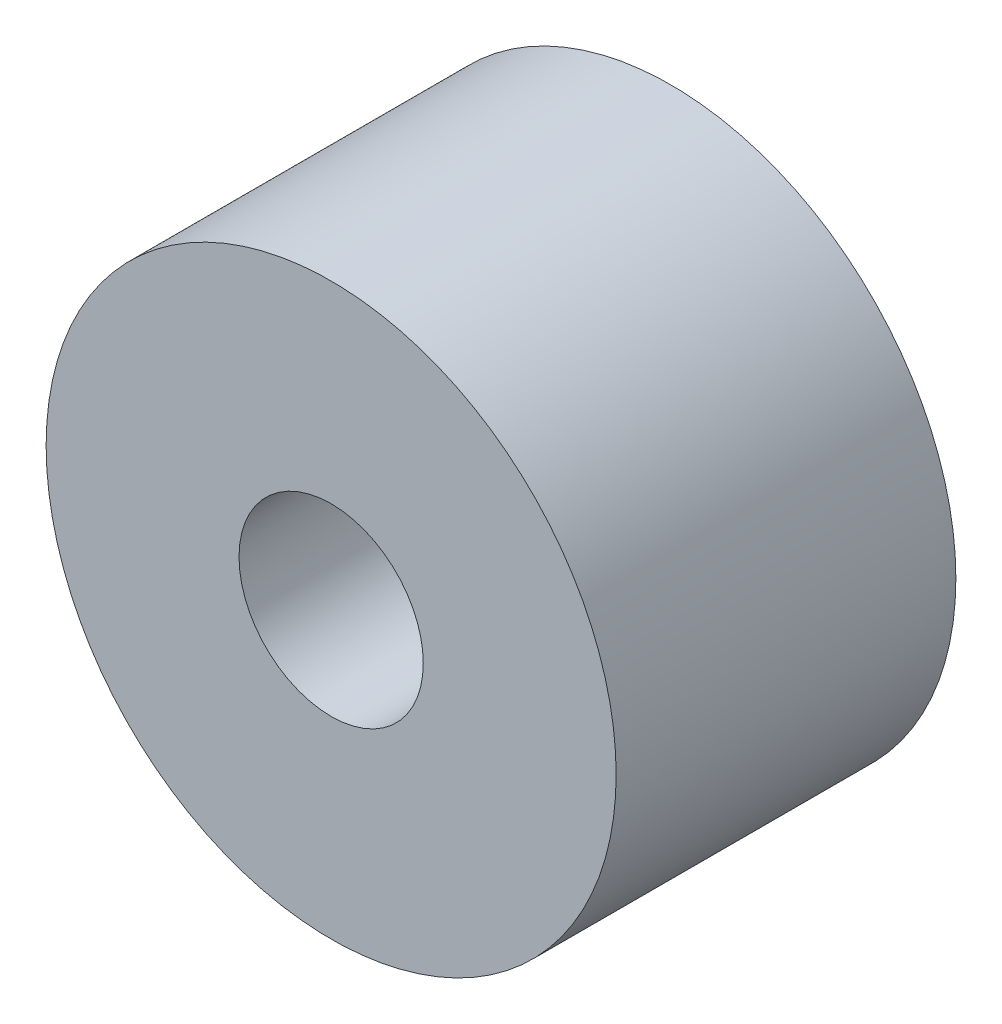
ISO-10303-21;
HEADER;
FILE_DESCRIPTION(('STEP AP214'),'2;1');
FILE_NAME('part.step','',(''),(''),'','','');
FILE_SCHEMA(('AUTOMOTIVE_DESIGN { 1 0 10303 214 1 1 1 1 }'));
ENDSEC;
DATA;
#1=APPLICATION_CONTEXT('core data for automotive mechanical design processes');
#2=APPLICATION_PROTOCOL_DEFINITION('international standard','automotive_design',2000,#1);
#3=PRODUCT_CONTEXT('',#1,'mechanical');
#4=PRODUCT('Part','Part','',(#3));
#5=PRODUCT_RELATED_PRODUCT_CATEGORY('part','',(#4));
#6=PRODUCT_DEFINITION_FORMATION('','',#4);
#7=PRODUCT_DEFINITION_CONTEXT('part definition',#1,'design');
#8=PRODUCT_DEFINITION('design','',#6,#7);
#9=PRODUCT_DEFINITION_SHAPE('','',#8);
#10=(LENGTH_UNIT() NAMED_UNIT(*) SI_UNIT(.MILLI.,.METRE.));
#11=(NAMED_UNIT(*) PLANE_ANGLE_UNIT() SI_UNIT($,.RADIAN.));
#12=(NAMED_UNIT(*) SI_UNIT($,.STERADIAN.) SOLID_ANGLE_UNIT());
#13=UNCERTAINTY_MEASURE_WITH_UNIT(LENGTH_MEASURE(1.E-05),#10,'distance_accuracy_value','');
#14=(GEOMETRIC_REPRESENTATION_CONTEXT(3) GLOBAL_UNCERTAINTY_ASSIGNED_CONTEXT((#13)) GLOBAL_UNIT_ASSIGNED_CONTEXT((#10,
#11,#12)) REPRESENTATION_CONTEXT('',''));
#15=CARTESIAN_POINT('',(0.,0.,0.));
#16=DIRECTION('',(0.,0.,1.));
#17=DIRECTION('',(1.,0.,0.));
#18=AXIS2_PLACEMENT_3D('',#15,#16,#17);
#19=CARTESIAN_POINT('',(0.,0.,10.4254833995939));
#20=DIRECTION('',(0.,0.,-1.));
#21=DIRECTION('',(-1.,0.,0.));
#22=AXIS2_PLACEMENT_3D('',#19,#20,#21);
#23=CYLINDRICAL_SURFACE('',#22,1.6);
#24=CARTESIAN_POINT('',(0.,0.,5.9));
#25=DIRECTION('',(0.,0.,1.));
#26=DIRECTION('',(1.,0.,0.));
#27=AXIS2_PLACEMENT_3D('',#24,#25,#26);
#28=CIRCLE('',#27,1.6);
#29=CARTESIAN_POINT('',(1.6,0.,5.9));
#30=VERTEX_POINT('',#29);
#31=EDGE_CURVE('E145',#30,#30,#28,.F.);
#32=ORIENTED_EDGE('',*,*,#31,.F.);
#33=EDGE_LOOP('',(#32));
#34=FACE_BOUND('',#33,.T.);
#35=CARTESIAN_POINT('',(0.,0.,3.));
#36=DIRECTION('',(0.,0.,-1.));
#37=DIRECTION('',(-1.,0.,0.));
#38=AXIS2_PLACEMENT_3D('',#35,#36,#37);
#39=CIRCLE('',#38,1.6);
#40=CARTESIAN_POINT('',(-1.6,0.,3.));
#41=VERTEX_POINT('',#40);
#42=EDGE_CURVE('E39',#41,#41,#39,.F.);
#43=ORIENTED_EDGE('',*,*,#42,.F.);
#44=EDGE_LOOP('',(#43));
#45=FACE_BOUND('',#44,.T.);
#46=ADVANCED_FACE('F35',(#34,#45),#23,.F.);
#47=CARTESIAN_POINT('',(0.,0.,5.9));
#48=DIRECTION('',(0.,0.,-1.));
#49=DIRECTION('',(-1.,0.,0.));
#50=AXIS2_PLACEMENT_3D('',#47,#48,#49);
#51=CYLINDRICAL_SURFACE('',#50,4.95);
#52=CARTESIAN_POINT('',(0.,0.,5.9));
#53=DIRECTION('',(0.,0.,1.));
#54=DIRECTION('',(1.,0.,0.));
#55=AXIS2_PLACEMENT_3D('',#52,#53,#54);
#56=CIRCLE('',#55,4.95);
#57=CARTESIAN_POINT('',(4.95,0.,5.9));
#58=VERTEX_POINT('',#57);
#59=EDGE_CURVE('E11',#58,#58,#56,.T.);
#60=ORIENTED_EDGE('',*,*,#59,.F.);
#61=EDGE_LOOP('',(#60));
#62=FACE_BOUND('',#61,.T.);
#63=CARTESIAN_POINT('',(0.,0.,0.));
#64=DIRECTION('',(0.,0.,1.));
#65=DIRECTION('',(1.,0.,0.));
#66=AXIS2_PLACEMENT_3D('',#63,#64,#65);
#67=CIRCLE('',#66,4.95);
#68=CARTESIAN_POINT('',(4.95,0.,0.));
#69=VERTEX_POINT('',#68);
#70=EDGE_CURVE('E44',#69,#69,#67,.T.);
#71=ORIENTED_EDGE('',*,*,#70,.T.);
#72=EDGE_LOOP('',(#71));
#73=FACE_BOUND('',#72,.T.);
#74=ADVANCED_FACE('F37',(#62,#73),#51,.T.);
#75=CARTESIAN_POINT('',(0.,0.,5.9));
#76=DIRECTION('',(0.,0.,1.));
#77=DIRECTION('',(1.,0.,0.));
#78=AXIS2_PLACEMENT_3D('',#75,#76,#77);
#79=PLANE('',#78);
#80=ORIENTED_EDGE('',*,*,#31,.T.);
#81=EDGE_LOOP('',(#80));
#82=FACE_BOUND('',#81,.T.);
#83=ORIENTED_EDGE('',*,*,#59,.T.);
#84=EDGE_LOOP('',(#83));
#85=FACE_BOUND('',#84,.T.);
#86=ADVANCED_FACE('F153',(#82,#85),#79,.T.);
#87=CARTESIAN_POINT('',(0.,0.,0.));
#88=DIRECTION('',(0.,0.,1.));
#89=DIRECTION('',(1.,0.,0.));
#90=AXIS2_PLACEMENT_3D('',#87,#88,#89);
#91=PLANE('',#90);
#92=DIRECTION('',(-0.972226533934309,0.234041805483719,0.));
#93=VECTOR('',#92,1.);
#94=CARTESIAN_POINT('',(0.949092992230001,-3.21131683666268,0.));
#95=LINE('',#94,#93);
#96=CARTESIAN_POINT('',(0.949092992230001,-3.21131683666268,0.));
#97=VERTEX_POINT('',#96);
#98=CARTESIAN_POINT('',(-2.30653546403557,-2.42759706015631,0.));
#99=VERTEX_POINT('',#98);
#100=EDGE_CURVE('E127',#97,#99,#95,.T.);
#101=ORIENTED_EDGE('',*,*,#100,.F.);
#102=DIRECTION('',(-0.688799416063631,-0.724951973878546,0.));
#103=VECTOR('',#102,1.);
#104=CARTESIAN_POINT('',(3.25562845626557,-0.783719776506375,0.));
#105=LINE('',#104,#103);
#106=CARTESIAN_POINT('',(3.25562845626557,-0.783719776506375,0.));
#107=VERTEX_POINT('',#106);
#108=EDGE_CURVE('E52',#107,#97,#105,.T.);
#109=ORIENTED_EDGE('',*,*,#108,.F.);
#110=DIRECTION('',(0.283427117870678,-0.958993779362265,0.));
#111=VECTOR('',#110,1.);
#112=CARTESIAN_POINT('',(2.30653546403557,2.42759706015631,0.));
#113=LINE('',#112,#111);
#114=CARTESIAN_POINT('',(2.30653546403557,2.42759706015631,0.));
#115=VERTEX_POINT('',#114);
#116=EDGE_CURVE('E136',#115,#107,#113,.T.);
#117=ORIENTED_EDGE('',*,*,#116,.F.);
#118=DIRECTION('',(0.972226533934309,-0.234041805483719,0.));
#119=VECTOR('',#118,1.);
#120=CARTESIAN_POINT('',(-0.949092992230001,3.21131683666269,0.));
#121=LINE('',#120,#119);
#122=CARTESIAN_POINT('',(-0.949092992230001,3.21131683666269,0.));
#123=VERTEX_POINT('',#122);
#124=EDGE_CURVE('E134',#123,#115,#121,.T.);
#125=ORIENTED_EDGE('',*,*,#124,.F.);
#126=DIRECTION('',(0.688799416063631,0.724951973878546,0.));
#127=VECTOR('',#126,1.);
#128=CARTESIAN_POINT('',(-3.25562845626557,0.783719776506377,0.));
#129=LINE('',#128,#127);
#130=CARTESIAN_POINT('',(-3.25562845626557,0.783719776506377,0.));
#131=VERTEX_POINT('',#130);
#132=EDGE_CURVE('E100',#131,#123,#129,.T.);
#133=ORIENTED_EDGE('',*,*,#132,.F.);
#134=DIRECTION('',(-0.283427117870678,0.958993779362265,0.));
#135=VECTOR('',#134,1.);
#136=CARTESIAN_POINT('',(-2.30653546403557,-2.42759706015631,0.));
#137=LINE('',#136,#135);
#138=EDGE_CURVE('E130',#99,#131,#137,.T.);
#139=ORIENTED_EDGE('',*,*,#138,.F.);
#140=EDGE_LOOP('',(#101,#109,#117,#125,#133,#139));
#141=FACE_BOUND('',#140,.T.);
#142=ORIENTED_EDGE('',*,*,#70,.F.);
#143=EDGE_LOOP('',(#142));
#144=FACE_BOUND('',#143,.T.);
#145=ADVANCED_FACE('F151',(#141,#144),#91,.F.);
#146=CARTESIAN_POINT('',(0.,0.,3.));
#147=DIRECTION('',(0.,0.,-1.));
#148=DIRECTION('',(-1.,0.,0.));
#149=AXIS2_PLACEMENT_3D('',#146,#147,#148);
#150=PLANE('',#149);
#151=DIRECTION('',(-0.688799416063631,-0.724951973878546,0.));
#152=VECTOR('',#151,1.);
#153=CARTESIAN_POINT('',(3.25562845626557,-0.783719776506375,3.));
#154=LINE('',#153,#152);
#155=CARTESIAN_POINT('',(3.25562845626557,-0.783719776506375,3.));
#156=VERTEX_POINT('',#155);
#157=CARTESIAN_POINT('',(0.949092992230001,-3.21131683666268,3.));
#158=VERTEX_POINT('',#157);
#159=EDGE_CURVE('E138',#156,#158,#154,.T.);
#160=ORIENTED_EDGE('',*,*,#159,.T.);
#161=DIRECTION('',(-0.972226533934309,0.234041805483719,0.));
#162=VECTOR('',#161,1.);
#163=CARTESIAN_POINT('',(0.949092992230001,-3.21131683666268,3.));
#164=LINE('',#163,#162);
#165=CARTESIAN_POINT('',(-2.30653546403557,-2.42759706015631,3.));
#166=VERTEX_POINT('',#165);
#167=EDGE_CURVE('E121',#158,#166,#164,.T.);
#168=ORIENTED_EDGE('',*,*,#167,.T.);
#169=DIRECTION('',(-0.283427117870678,0.958993779362265,0.));
#170=VECTOR('',#169,1.);
#171=CARTESIAN_POINT('',(-2.30653546403557,-2.42759706015631,3.));
#172=LINE('',#171,#170);
#173=CARTESIAN_POINT('',(-3.25562845626557,0.783719776506377,3.));
#174=VERTEX_POINT('',#173);
#175=EDGE_CURVE('E119',#166,#174,#172,.T.);
#176=ORIENTED_EDGE('',*,*,#175,.T.);
#177=DIRECTION('',(0.688799416063631,0.724951973878546,0.));
#178=VECTOR('',#177,1.);
#179=CARTESIAN_POINT('',(-3.25562845626557,0.783719776506377,3.));
#180=LINE('',#179,#178);
#181=CARTESIAN_POINT('',(-0.949092992230001,3.21131683666269,3.));
#182=VERTEX_POINT('',#181);
#183=EDGE_CURVE('E97',#174,#182,#180,.T.);
#184=ORIENTED_EDGE('',*,*,#183,.T.);
#185=DIRECTION('',(0.972226533934309,-0.234041805483719,0.));
#186=VECTOR('',#185,1.);
#187=CARTESIAN_POINT('',(-0.949092992230001,3.21131683666269,3.));
#188=LINE('',#187,#186);
#189=CARTESIAN_POINT('',(2.30653546403557,2.42759706015631,3.));
#190=VERTEX_POINT('',#189);
#191=EDGE_CURVE('E108',#182,#190,#188,.T.);
#192=ORIENTED_EDGE('',*,*,#191,.T.);
#193=DIRECTION('',(0.283427117870678,-0.958993779362265,0.));
#194=VECTOR('',#193,1.);
#195=CARTESIAN_POINT('',(2.30653546403557,2.42759706015631,3.));
#196=LINE('',#195,#194);
#197=EDGE_CURVE('E112',#190,#156,#196,.T.);
#198=ORIENTED_EDGE('',*,*,#197,.T.);
#199=EDGE_LOOP('',(#160,#168,#176,#184,#192,#198));
#200=FACE_BOUND('',#199,.T.);
#201=ORIENTED_EDGE('',*,*,#42,.T.);
#202=EDGE_LOOP('',(#201));
#203=FACE_BOUND('',#202,.T.);
#204=ADVANCED_FACE('F115',(#200,#203),#150,.T.);
#205=CARTESIAN_POINT('',(3.25562845626557,-0.783719776506375,3.));
#206=DIRECTION('',(0.724951973878546,-0.688799416063631,0.));
#207=DIRECTION('',(0.688799416063631,0.724951973878547,0.));
#208=AXIS2_PLACEMENT_3D('',#205,#206,#207);
#209=PLANE('',#208);
#210=ORIENTED_EDGE('',*,*,#108,.T.);
#211=DIRECTION('',(0.,0.,-1.));
#212=VECTOR('',#211,1.);
#213=CARTESIAN_POINT('',(0.949092992230001,-3.21131683666268,3.));
#214=LINE('',#213,#212);
#215=EDGE_CURVE('E82',#158,#97,#214,.T.);
#216=ORIENTED_EDGE('',*,*,#215,.F.);
#217=ORIENTED_EDGE('',*,*,#159,.F.);
#218=DIRECTION('',(0.,0.,-1.));
#219=VECTOR('',#218,1.);
#220=CARTESIAN_POINT('',(3.25562845626557,-0.783719776506375,3.));
#221=LINE('',#220,#219);
#222=EDGE_CURVE('E60',#156,#107,#221,.T.);
#223=ORIENTED_EDGE('',*,*,#222,.T.);
#224=EDGE_LOOP('',(#210,#216,#217,#223));
#225=FACE_BOUND('',#224,.T.);
#226=ADVANCED_FACE('F159',(#225),#209,.F.);
#227=CARTESIAN_POINT('',(2.30653546403557,2.42759706015631,3.));
#228=DIRECTION('',(0.958993779362265,0.283427117870678,0.));
#229=DIRECTION('',(-0.283427117870678,0.958993779362265,0.));
#230=AXIS2_PLACEMENT_3D('',#227,#228,#229);
#231=PLANE('',#230);
#232=ORIENTED_EDGE('',*,*,#116,.T.);
#233=ORIENTED_EDGE('',*,*,#222,.F.);
#234=ORIENTED_EDGE('',*,*,#197,.F.);
#235=DIRECTION('',(0.,0.,-1.));
#236=VECTOR('',#235,1.);
#237=CARTESIAN_POINT('',(2.30653546403557,2.42759706015631,3.));
#238=LINE('',#237,#236);
#239=EDGE_CURVE('E104',#190,#115,#238,.T.);
#240=ORIENTED_EDGE('',*,*,#239,.T.);
#241=EDGE_LOOP('',(#232,#233,#234,#240));
#242=FACE_BOUND('',#241,.T.);
#243=ADVANCED_FACE('F176',(#242),#231,.F.);
#244=CARTESIAN_POINT('',(-0.949092992230001,3.21131683666269,3.));
#245=DIRECTION('',(0.234041805483719,0.97222653393431,0.));
#246=DIRECTION('',(-0.97222653393431,0.234041805483719,0.));
#247=AXIS2_PLACEMENT_3D('',#244,#245,#246);
#248=PLANE('',#247);
#249=ORIENTED_EDGE('',*,*,#124,.T.);
#250=ORIENTED_EDGE('',*,*,#239,.F.);
#251=ORIENTED_EDGE('',*,*,#191,.F.);
#252=DIRECTION('',(0.,0.,-1.));
#253=VECTOR('',#252,1.);
#254=CARTESIAN_POINT('',(-0.949092992230001,3.21131683666269,3.));
#255=LINE('',#254,#253);
#256=EDGE_CURVE('E93',#182,#123,#255,.T.);
#257=ORIENTED_EDGE('',*,*,#256,.T.);
#258=EDGE_LOOP('',(#249,#250,#251,#257));
#259=FACE_BOUND('',#258,.T.);
#260=ADVANCED_FACE('F109',(#259),#248,.F.);
#261=CARTESIAN_POINT('',(-3.25562845626557,0.783719776506377,3.));
#262=DIRECTION('',(-0.724951973878546,0.688799416063631,0.));
#263=DIRECTION('',(-0.688799416063631,-0.724951973878547,0.));
#264=AXIS2_PLACEMENT_3D('',#261,#262,#263);
#265=PLANE('',#264);
#266=ORIENTED_EDGE('',*,*,#132,.T.);
#267=ORIENTED_EDGE('',*,*,#256,.F.);
#268=ORIENTED_EDGE('',*,*,#183,.F.);
#269=DIRECTION('',(0.,0.,-1.));
#270=VECTOR('',#269,1.);
#271=CARTESIAN_POINT('',(-3.25562845626557,0.783719776506377,3.));
#272=LINE('',#271,#270);
#273=EDGE_CURVE('E105',#174,#131,#272,.T.);
#274=ORIENTED_EDGE('',*,*,#273,.T.);
#275=EDGE_LOOP('',(#266,#267,#268,#274));
#276=FACE_BOUND('',#275,.T.);
#277=ADVANCED_FACE('F95',(#276),#265,.F.);
#278=CARTESIAN_POINT('',(-2.30653546403557,-2.42759706015631,3.));
#279=DIRECTION('',(-0.958993779362265,-0.283427117870678,0.));
#280=DIRECTION('',(0.283427117870678,-0.958993779362265,0.));
#281=AXIS2_PLACEMENT_3D('',#278,#279,#280);
#282=PLANE('',#281);
#283=ORIENTED_EDGE('',*,*,#138,.T.);
#284=ORIENTED_EDGE('',*,*,#273,.F.);
#285=ORIENTED_EDGE('',*,*,#175,.F.);
#286=DIRECTION('',(0.,0.,-1.));
#287=VECTOR('',#286,1.);
#288=CARTESIAN_POINT('',(-2.30653546403557,-2.42759706015631,3.));
#289=LINE('',#288,#287);
#290=EDGE_CURVE('E142',#166,#99,#289,.T.);
#291=ORIENTED_EDGE('',*,*,#290,.T.);
#292=EDGE_LOOP('',(#283,#284,#285,#291));
#293=FACE_BOUND('',#292,.T.);
#294=ADVANCED_FACE('F180',(#293),#282,.F.);
#295=CARTESIAN_POINT('',(0.949092992230001,-3.21131683666268,3.));
#296=DIRECTION('',(-0.234041805483719,-0.97222653393431,0.));
#297=DIRECTION('',(0.97222653393431,-0.234041805483719,0.));
#298=AXIS2_PLACEMENT_3D('',#295,#296,#297);
#299=PLANE('',#298);
#300=ORIENTED_EDGE('',*,*,#100,.T.);
#301=ORIENTED_EDGE('',*,*,#290,.F.);
#302=ORIENTED_EDGE('',*,*,#167,.F.);
#303=ORIENTED_EDGE('',*,*,#215,.T.);
#304=EDGE_LOOP('',(#300,#301,#302,#303));
#305=FACE_BOUND('',#304,.T.);
#306=ADVANCED_FACE('F177',(#305),#299,.F.);
#307=CLOSED_SHELL('',(#46,#74,#86,#145,#204,#226,#243,#260,#277,#294,#306));
#308=MANIFOLD_SOLID_BREP('B2',#307);
#309=ADVANCED_BREP_SHAPE_REPRESENTATION('',(#18,#308),#14);
#310=SHAPE_DEFINITION_REPRESENTATION(#9,#309);
ENDSEC;
END-ISO-10303-21;
